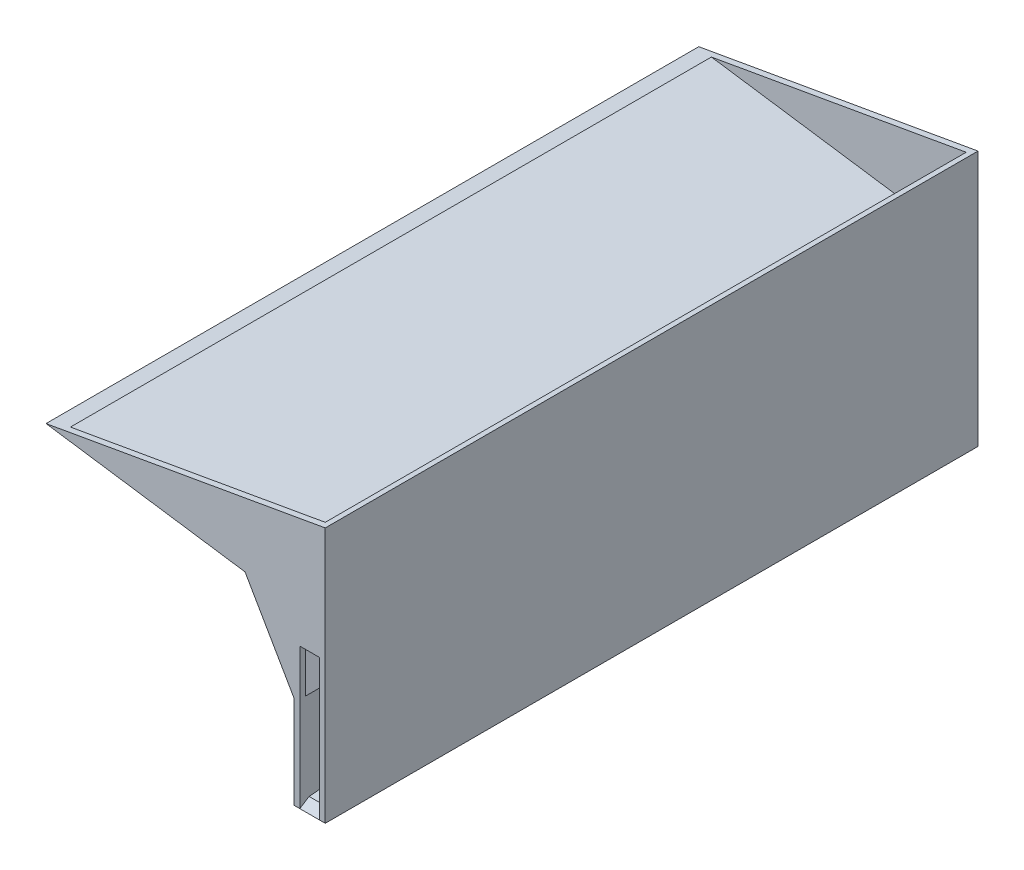
ISO-10303-21;
HEADER;
FILE_DESCRIPTION(('STEP AP214'),'2;1');
FILE_NAME('part.step','',(''),(''),'','','');
FILE_SCHEMA(('AUTOMOTIVE_DESIGN { 1 0 10303 214 1 1 1 1 }'));
ENDSEC;
DATA;
#1=APPLICATION_CONTEXT('core data for automotive mechanical design processes');
#2=APPLICATION_PROTOCOL_DEFINITION('international standard','automotive_design',2000,#1);
#3=PRODUCT_CONTEXT('',#1,'mechanical');
#4=PRODUCT('Part','Part','',(#3));
#5=PRODUCT_RELATED_PRODUCT_CATEGORY('part','',(#4));
#6=PRODUCT_DEFINITION_FORMATION('','',#4);
#7=PRODUCT_DEFINITION_CONTEXT('part definition',#1,'design');
#8=PRODUCT_DEFINITION('design','',#6,#7);
#9=PRODUCT_DEFINITION_SHAPE('','',#8);
#10=(LENGTH_UNIT() NAMED_UNIT(*) SI_UNIT(.MILLI.,.METRE.));
#11=(NAMED_UNIT(*) PLANE_ANGLE_UNIT() SI_UNIT($,.RADIAN.));
#12=(NAMED_UNIT(*) SI_UNIT($,.STERADIAN.) SOLID_ANGLE_UNIT());
#13=UNCERTAINTY_MEASURE_WITH_UNIT(LENGTH_MEASURE(1.E-05),#10,'distance_accuracy_value','');
#14=(GEOMETRIC_REPRESENTATION_CONTEXT(3) GLOBAL_UNCERTAINTY_ASSIGNED_CONTEXT((#13)) GLOBAL_UNIT_ASSIGNED_CONTEXT((#10,
#11,#12)) REPRESENTATION_CONTEXT('',''));
#15=CARTESIAN_POINT('',(0.,0.,0.));
#16=DIRECTION('',(0.,0.,1.));
#17=DIRECTION('',(1.,0.,0.));
#18=AXIS2_PLACEMENT_3D('',#15,#16,#17);
#19=CARTESIAN_POINT('',(12.7,-200.,701.675));
#20=DIRECTION('',(1.,0.,0.));
#21=DIRECTION('',(0.,0.,-1.));
#22=AXIS2_PLACEMENT_3D('',#19,#20,#21);
#23=PLANE('',#22);
#24=DIRECTION('',(0.,-1.,0.));
#25=VECTOR('',#24,1.);
#26=CARTESIAN_POINT('',(12.7,-187.3,701.675));
#27=LINE('',#26,#25);
#28=CARTESIAN_POINT('',(12.7,102.7,701.675));
#29=VERTEX_POINT('',#28);
#30=CARTESIAN_POINT('',(12.7,-200.,701.675));
#31=VERTEX_POINT('',#30);
#32=EDGE_CURVE('E69',#29,#31,#27,.T.);
#33=ORIENTED_EDGE('',*,*,#32,.T.);
#34=DIRECTION('',(0.,-0.536055885401426,0.844182496695172));
#35=VECTOR('',#34,1.);
#36=CARTESIAN_POINT('',(12.7,-187.3,681.675));
#37=LINE('',#36,#35);
#38=CARTESIAN_POINT('',(12.7,-187.3,681.675));
#39=VERTEX_POINT('',#38);
#40=EDGE_CURVE('E11',#31,#39,#37,.F.);
#41=ORIENTED_EDGE('',*,*,#40,.T.);
#42=DIRECTION('',(0.,-0.0871557427476516,0.996194698091746));
#43=VECTOR('',#42,1.);
#44=CARTESIAN_POINT('',(12.7,-67.3836633382015,-688.975));
#45=LINE('',#44,#43);
#46=CARTESIAN_POINT('',(12.7,-67.3836633382015,-688.975));
#47=VERTEX_POINT('',#46);
#48=EDGE_CURVE('E158',#47,#39,#45,.T.);
#49=ORIENTED_EDGE('',*,*,#48,.F.);
#50=DIRECTION('',(0.,-1.,0.));
#51=VECTOR('',#50,1.);
#52=CARTESIAN_POINT('',(12.7,-200.,-688.975));
#53=LINE('',#52,#51);
#54=CARTESIAN_POINT('',(12.7,3.40295474387526,-688.975));
#55=VERTEX_POINT('',#54);
#56=EDGE_CURVE('E170',#55,#47,#53,.T.);
#57=ORIENTED_EDGE('',*,*,#56,.F.);
#58=DIRECTION('',(0.,0.,-1.));
#59=VECTOR('',#58,1.);
#60=CARTESIAN_POINT('',(12.7,3.40295474387526,701.675));
#61=LINE('',#60,#59);
#62=CARTESIAN_POINT('',(12.7,3.40295474387526,688.975));
#63=VERTEX_POINT('',#62);
#64=EDGE_CURVE('E190',#63,#55,#61,.T.);
#65=ORIENTED_EDGE('',*,*,#64,.F.);
#66=DIRECTION('',(0.,-1.,0.));
#67=VECTOR('',#66,1.);
#68=CARTESIAN_POINT('',(12.7,0.,688.975));
#69=LINE('',#68,#67);
#70=CARTESIAN_POINT('',(12.7,102.7,688.975));
#71=VERTEX_POINT('',#70);
#72=EDGE_CURVE('E295',#71,#63,#69,.T.);
#73=ORIENTED_EDGE('',*,*,#72,.F.);
#74=DIRECTION('',(0.,0.,1.));
#75=VECTOR('',#74,1.);
#76=CARTESIAN_POINT('',(12.7,102.7,681.675));
#77=LINE('',#76,#75);
#78=EDGE_CURVE('E180',#71,#29,#77,.T.);
#79=ORIENTED_EDGE('',*,*,#78,.T.);
#80=EDGE_LOOP('',(#33,#41,#49,#57,#65,#73,#79));
#81=FACE_BOUND('',#80,.T.);
#82=ADVANCED_FACE('F45',(#81),#23,.T.);
#83=CARTESIAN_POINT('',(54.6999999999999,350.,701.675));
#84=DIRECTION('',(-1.,0.,0.));
#85=DIRECTION('',(0.,-1.,0.));
#86=AXIS2_PLACEMENT_3D('',#83,#84,#85);
#87=PLANE('',#86);
#88=DIRECTION('',(0.,1.,0.));
#89=VECTOR('',#88,1.);
#90=CARTESIAN_POINT('',(54.6999999999999,350.,-688.975));
#91=LINE('',#90,#89);
#92=CARTESIAN_POINT('',(54.7,-67.3836633382014,-688.975));
#93=VERTEX_POINT('',#92);
#94=CARTESIAN_POINT('',(54.6999999999999,347.760647345002,-688.975));
#95=VERTEX_POINT('',#94);
#96=EDGE_CURVE('E179',#93,#95,#91,.T.);
#97=ORIENTED_EDGE('',*,*,#96,.F.);
#98=DIRECTION('',(0.,0.0871557427476516,-0.996194698091746));
#99=VECTOR('',#98,1.);
#100=CARTESIAN_POINT('',(54.7,-67.3836633382015,-688.975));
#101=LINE('',#100,#99);
#102=CARTESIAN_POINT('',(54.7,-187.3,681.675));
#103=VERTEX_POINT('',#102);
#104=EDGE_CURVE('E161',#103,#93,#101,.T.);
#105=ORIENTED_EDGE('',*,*,#104,.F.);
#106=DIRECTION('',(0.,0.536055885401426,-0.844182496695172));
#107=VECTOR('',#106,1.);
#108=CARTESIAN_POINT('',(54.7,-187.3,681.675));
#109=LINE('',#108,#107);
#110=CARTESIAN_POINT('',(54.7,-200.,701.675));
#111=VERTEX_POINT('',#110);
#112=EDGE_CURVE('E55',#103,#111,#109,.F.);
#113=ORIENTED_EDGE('',*,*,#112,.T.);
#114=DIRECTION('',(0.,1.,0.));
#115=VECTOR('',#114,1.);
#116=CARTESIAN_POINT('',(54.7,-187.3,701.675));
#117=LINE('',#116,#115);
#118=CARTESIAN_POINT('',(54.7,102.7,701.675));
#119=VERTEX_POINT('',#118);
#120=EDGE_CURVE('E62',#111,#119,#117,.T.);
#121=ORIENTED_EDGE('',*,*,#120,.T.);
#122=DIRECTION('',(0.,0.,1.));
#123=VECTOR('',#122,1.);
#124=CARTESIAN_POINT('',(54.7,102.7,681.675));
#125=LINE('',#124,#123);
#126=CARTESIAN_POINT('',(54.7,102.7,688.975));
#127=VERTEX_POINT('',#126);
#128=EDGE_CURVE('E186',#127,#119,#125,.T.);
#129=ORIENTED_EDGE('',*,*,#128,.F.);
#130=DIRECTION('',(0.,1.,0.));
#131=VECTOR('',#130,1.);
#132=CARTESIAN_POINT('',(54.6999999999999,350.,688.975));
#133=LINE('',#132,#131);
#134=CARTESIAN_POINT('',(54.6999999999999,347.760647345002,688.975));
#135=VERTEX_POINT('',#134);
#136=EDGE_CURVE('E195',#127,#135,#133,.T.);
#137=ORIENTED_EDGE('',*,*,#136,.T.);
#138=DIRECTION('',(0.,0.,-1.));
#139=VECTOR('',#138,1.);
#140=CARTESIAN_POINT('',(54.7,347.760647345002,701.675));
#141=LINE('',#140,#139);
#142=EDGE_CURVE('E214',#135,#95,#141,.T.);
#143=ORIENTED_EDGE('',*,*,#142,.T.);
#144=EDGE_LOOP('',(#97,#105,#113,#121,#129,#137,#143));
#145=FACE_BOUND('',#144,.T.);
#146=ADVANCED_FACE('F300',(#145),#87,.T.);
#147=CARTESIAN_POINT('',(0.,0.,-688.975));
#148=DIRECTION('',(0.,0.,1.));
#149=DIRECTION('',(1.,0.,0.));
#150=AXIS2_PLACEMENT_3D('',#147,#148,#149);
#151=PLANE('',#150);
#152=ORIENTED_EDGE('',*,*,#56,.T.);
#153=DIRECTION('',(-1.,0.,0.));
#154=VECTOR('',#153,1.);
#155=CARTESIAN_POINT('',(1430.58566032879,-67.3836633382015,-688.975));
#156=LINE('',#155,#154);
#157=EDGE_CURVE('E154',#93,#47,#156,.T.);
#158=ORIENTED_EDGE('',*,*,#157,.F.);
#159=ORIENTED_EDGE('',*,*,#96,.T.);
#160=DIRECTION('',(-0.984807753012207,-0.173648177666935,0.));
#161=VECTOR('',#160,1.);
#162=CARTESIAN_POINT('',(-532.938806236242,244.144070894237,-688.975));
#163=LINE('',#162,#161);
#164=CARTESIAN_POINT('',(-493.064851650338,251.174924915276,-688.975));
#165=VERTEX_POINT('',#164);
#166=EDGE_CURVE('E184',#95,#165,#163,.T.);
#167=ORIENTED_EDGE('',*,*,#166,.T.);
#168=DIRECTION('',(0.989575536629476,-0.144014781548581,0.));
#169=VECTOR('',#168,1.);
#170=CARTESIAN_POINT('',(-103.171012274333,194.432944109926,-688.975));
#171=LINE('',#170,#169);
#172=CARTESIAN_POINT('',(-97.0793793235045,193.546417355561,-688.975));
#173=VERTEX_POINT('',#172);
#174=EDGE_CURVE('E205',#165,#173,#171,.T.);
#175=ORIENTED_EDGE('',*,*,#174,.T.);
#176=DIRECTION('',(0.500000000000001,-0.866025403784438,0.));
#177=VECTOR('',#176,1.);
#178=CARTESIAN_POINT('',(10.9985226280624,6.35000000000002,-688.975));
#179=LINE('',#178,#177);
#180=EDGE_CURVE('E177',#173,#55,#179,.T.);
#181=ORIENTED_EDGE('',*,*,#180,.T.);
#182=EDGE_LOOP('',(#152,#158,#159,#167,#175,#181));
#183=FACE_BOUND('',#182,.T.);
#184=ADVANCED_FACE('F175',(#183),#151,.T.);
#185=CARTESIAN_POINT('',(-532.938806236242,244.144070894237,701.675));
#186=DIRECTION('',(0.173648177666935,-0.984807753012207,0.));
#187=DIRECTION('',(0.984807753012207,0.173648177666935,0.));
#188=AXIS2_PLACEMENT_3D('',#185,#186,#187);
#189=PLANE('',#188);
#190=DIRECTION('',(-0.984807753012207,-0.173648177666935,0.));
#191=VECTOR('',#190,1.);
#192=CARTESIAN_POINT('',(-532.938806236242,244.144070894237,-701.675));
#193=LINE('',#192,#191);
#194=CARTESIAN_POINT('',(67.3999999999999,350.,-701.675));
#195=VERTEX_POINT('',#194);
#196=CARTESIAN_POINT('',(-532.938806236242,244.144070894237,-701.675));
#197=VERTEX_POINT('',#196);
#198=EDGE_CURVE('E260',#195,#197,#193,.T.);
#199=ORIENTED_EDGE('',*,*,#198,.T.);
#200=DIRECTION('',(0.,0.,-1.));
#201=VECTOR('',#200,1.);
#202=CARTESIAN_POINT('',(-532.938806236242,244.144070894237,701.675));
#203=LINE('',#202,#201);
#204=CARTESIAN_POINT('',(-532.938806236242,244.144070894237,701.675));
#205=VERTEX_POINT('',#204);
#206=EDGE_CURVE('E275',#205,#197,#203,.T.);
#207=ORIENTED_EDGE('',*,*,#206,.F.);
#208=DIRECTION('',(-0.984807753012207,-0.173648177666935,0.));
#209=VECTOR('',#208,1.);
#210=CARTESIAN_POINT('',(-532.938806236242,244.144070894237,701.675));
#211=LINE('',#210,#209);
#212=CARTESIAN_POINT('',(67.3999999999999,350.,701.675));
#213=VERTEX_POINT('',#212);
#214=EDGE_CURVE('E241',#213,#205,#211,.T.);
#215=ORIENTED_EDGE('',*,*,#214,.F.);
#216=DIRECTION('',(0.,0.,-1.));
#217=VECTOR('',#216,1.);
#218=CARTESIAN_POINT('',(67.3999999999999,350.,701.675));
#219=LINE('',#218,#217);
#220=EDGE_CURVE('E279',#213,#195,#219,.T.);
#221=ORIENTED_EDGE('',*,*,#220,.T.);
#222=EDGE_LOOP('',(#199,#207,#215,#221));
#223=FACE_BOUND('',#222,.T.);
#224=ORIENTED_EDGE('',*,*,#166,.F.);
#225=ORIENTED_EDGE('',*,*,#142,.F.);
#226=DIRECTION('',(-0.984807753012207,-0.173648177666935,0.));
#227=VECTOR('',#226,1.);
#228=CARTESIAN_POINT('',(-532.938806236242,244.144070894237,688.975));
#229=LINE('',#228,#227);
#230=CARTESIAN_POINT('',(-493.064851650338,251.174924915276,688.975));
#231=VERTEX_POINT('',#230);
#232=EDGE_CURVE('E198',#135,#231,#229,.T.);
#233=ORIENTED_EDGE('',*,*,#232,.T.);
#234=DIRECTION('',(0.,0.,-1.));
#235=VECTOR('',#234,1.);
#236=CARTESIAN_POINT('',(-493.064851650338,251.174924915276,701.675));
#237=LINE('',#236,#235);
#238=EDGE_CURVE('E211',#231,#165,#237,.T.);
#239=ORIENTED_EDGE('',*,*,#238,.T.);
#240=EDGE_LOOP('',(#224,#225,#233,#239));
#241=FACE_BOUND('',#240,.T.);
#242=ADVANCED_FACE('F335',(#223,#241),#189,.F.);
#243=CARTESIAN_POINT('',(0.,-200.,701.675));
#244=DIRECTION('',(1.,0.,0.));
#245=DIRECTION('',(0.,0.,-1.));
#246=AXIS2_PLACEMENT_3D('',#243,#244,#245);
#247=PLANE('',#246);
#248=DIRECTION('',(0.,-1.,0.));
#249=VECTOR('',#248,1.);
#250=CARTESIAN_POINT('',(0.,-200.,-701.675));
#251=LINE('',#250,#249);
#252=CARTESIAN_POINT('',(0.,0.,-701.675));
#253=VERTEX_POINT('',#252);
#254=CARTESIAN_POINT('',(0.,-200.,-701.675));
#255=VERTEX_POINT('',#254);
#256=EDGE_CURVE('E218',#253,#255,#251,.T.);
#257=ORIENTED_EDGE('',*,*,#256,.T.);
#258=DIRECTION('',(0.,0.,-1.));
#259=VECTOR('',#258,1.);
#260=CARTESIAN_POINT('',(0.,-200.,701.675));
#261=LINE('',#260,#259);
#262=CARTESIAN_POINT('',(0.,-200.,701.675));
#263=VERTEX_POINT('',#262);
#264=EDGE_CURVE('E287',#263,#255,#261,.T.);
#265=ORIENTED_EDGE('',*,*,#264,.F.);
#266=DIRECTION('',(0.,-1.,0.));
#267=VECTOR('',#266,1.);
#268=CARTESIAN_POINT('',(0.,-200.,701.675));
#269=LINE('',#268,#267);
#270=CARTESIAN_POINT('',(0.,0.,701.675));
#271=VERTEX_POINT('',#270);
#272=EDGE_CURVE('E227',#271,#263,#269,.T.);
#273=ORIENTED_EDGE('',*,*,#272,.F.);
#274=DIRECTION('',(0.,0.,-1.));
#275=VECTOR('',#274,1.);
#276=CARTESIAN_POINT('',(0.,0.,701.675));
#277=LINE('',#276,#275);
#278=EDGE_CURVE('E250',#271,#253,#277,.T.);
#279=ORIENTED_EDGE('',*,*,#278,.T.);
#280=EDGE_LOOP('',(#257,#265,#273,#279));
#281=FACE_BOUND('',#280,.T.);
#282=ADVANCED_FACE('F398',(#281),#247,.F.);
#283=CARTESIAN_POINT('',(67.4,-200.,701.675));
#284=DIRECTION('',(0.,1.,0.));
#285=DIRECTION('',(0.,0.,1.));
#286=AXIS2_PLACEMENT_3D('',#283,#284,#285);
#287=PLANE('',#286);
#288=DIRECTION('',(1.,0.,0.));
#289=VECTOR('',#288,1.);
#290=CARTESIAN_POINT('',(67.4,-200.,-701.675));
#291=LINE('',#290,#289);
#292=CARTESIAN_POINT('',(67.4,-200.,-701.675));
#293=VERTEX_POINT('',#292);
#294=EDGE_CURVE('E254',#255,#293,#291,.T.);
#295=ORIENTED_EDGE('',*,*,#294,.T.);
#296=DIRECTION('',(0.,0.,-1.));
#297=VECTOR('',#296,1.);
#298=CARTESIAN_POINT('',(67.4,-200.,701.675));
#299=LINE('',#298,#297);
#300=CARTESIAN_POINT('',(67.4,-200.,701.675));
#301=VERTEX_POINT('',#300);
#302=EDGE_CURVE('E283',#301,#293,#299,.T.);
#303=ORIENTED_EDGE('',*,*,#302,.F.);
#304=DIRECTION('',(1.,0.,0.));
#305=VECTOR('',#304,1.);
#306=CARTESIAN_POINT('',(67.4,-200.,701.675));
#307=LINE('',#306,#305);
#308=EDGE_CURVE('E231',#111,#301,#307,.T.);
#309=ORIENTED_EDGE('',*,*,#308,.F.);
#310=EDGE_CURVE('E238',#31,#111,#307,.T.);
#311=ORIENTED_EDGE('',*,*,#310,.F.);
#312=EDGE_CURVE('E233',#263,#31,#307,.T.);
#313=ORIENTED_EDGE('',*,*,#312,.F.);
#314=ORIENTED_EDGE('',*,*,#264,.T.);
#315=EDGE_LOOP('',(#295,#303,#309,#311,#313,#314));
#316=FACE_BOUND('',#315,.T.);
#317=ADVANCED_FACE('F306',(#316),#287,.F.);
#318=CARTESIAN_POINT('',(67.3999999999999,350.,701.675));
#319=DIRECTION('',(-1.,0.,0.));
#320=DIRECTION('',(0.,-1.,0.));
#321=AXIS2_PLACEMENT_3D('',#318,#319,#320);
#322=PLANE('',#321);
#323=DIRECTION('',(0.,1.,0.));
#324=VECTOR('',#323,1.);
#325=CARTESIAN_POINT('',(67.3999999999999,350.,-701.675));
#326=LINE('',#325,#324);
#327=EDGE_CURVE('E257',#293,#195,#326,.T.);
#328=ORIENTED_EDGE('',*,*,#327,.T.);
#329=ORIENTED_EDGE('',*,*,#220,.F.);
#330=DIRECTION('',(0.,1.,0.));
#331=VECTOR('',#330,1.);
#332=CARTESIAN_POINT('',(67.3999999999999,350.,701.675));
#333=LINE('',#332,#331);
#334=EDGE_CURVE('E237',#301,#213,#333,.T.);
#335=ORIENTED_EDGE('',*,*,#334,.F.);
#336=ORIENTED_EDGE('',*,*,#302,.T.);
#337=EDGE_LOOP('',(#328,#329,#335,#336));
#338=FACE_BOUND('',#337,.T.);
#339=ADVANCED_FACE('F397',(#338),#322,.F.);
#340=CARTESIAN_POINT('',(-105.,181.865334794732,701.675));
#341=DIRECTION('',(0.144014781548581,0.989575536629476,0.));
#342=DIRECTION('',(-0.989575536629476,0.144014781548581,0.));
#343=AXIS2_PLACEMENT_3D('',#340,#341,#342);
#344=PLANE('',#343);
#345=DIRECTION('',(0.989575536629476,-0.144014781548581,0.));
#346=VECTOR('',#345,1.);
#347=CARTESIAN_POINT('',(-105.,181.865334794732,-701.675));
#348=LINE('',#347,#346);
#349=CARTESIAN_POINT('',(-105.,181.865334794732,-701.675));
#350=VERTEX_POINT('',#349);
#351=EDGE_CURVE('E263',#197,#350,#348,.T.);
#352=ORIENTED_EDGE('',*,*,#351,.T.);
#353=DIRECTION('',(0.,0.,-1.));
#354=VECTOR('',#353,1.);
#355=CARTESIAN_POINT('',(-105.,181.865334794732,701.675));
#356=LINE('',#355,#354);
#357=CARTESIAN_POINT('',(-105.,181.865334794732,701.675));
#358=VERTEX_POINT('',#357);
#359=EDGE_CURVE('E271',#358,#350,#356,.T.);
#360=ORIENTED_EDGE('',*,*,#359,.F.);
#361=DIRECTION('',(0.989575536629476,-0.144014781548581,0.));
#362=VECTOR('',#361,1.);
#363=CARTESIAN_POINT('',(-105.,181.865334794732,701.675));
#364=LINE('',#363,#362);
#365=EDGE_CURVE('E244',#205,#358,#364,.T.);
#366=ORIENTED_EDGE('',*,*,#365,.F.);
#367=ORIENTED_EDGE('',*,*,#206,.T.);
#368=EDGE_LOOP('',(#352,#360,#366,#367));
#369=FACE_BOUND('',#368,.T.);
#370=ADVANCED_FACE('F470',(#369),#344,.F.);
#371=CARTESIAN_POINT('',(0.,0.,701.675));
#372=DIRECTION('',(0.866025403784438,0.500000000000001,0.));
#373=DIRECTION('',(-0.500000000000001,0.866025403784438,0.));
#374=AXIS2_PLACEMENT_3D('',#371,#372,#373);
#375=PLANE('',#374);
#376=DIRECTION('',(0.500000000000001,-0.866025403784438,0.));
#377=VECTOR('',#376,1.);
#378=CARTESIAN_POINT('',(0.,0.,-701.675));
#379=LINE('',#378,#377);
#380=EDGE_CURVE('E232',#350,#253,#379,.T.);
#381=ORIENTED_EDGE('',*,*,#380,.T.);
#382=ORIENTED_EDGE('',*,*,#278,.F.);
#383=DIRECTION('',(0.500000000000001,-0.866025403784438,0.));
#384=VECTOR('',#383,1.);
#385=CARTESIAN_POINT('',(0.,0.,701.675));
#386=LINE('',#385,#384);
#387=EDGE_CURVE('E247',#358,#271,#386,.T.);
#388=ORIENTED_EDGE('',*,*,#387,.F.);
#389=ORIENTED_EDGE('',*,*,#359,.T.);
#390=EDGE_LOOP('',(#381,#382,#388,#389));
#391=FACE_BOUND('',#390,.T.);
#392=ADVANCED_FACE('F383',(#391),#375,.F.);
#393=CARTESIAN_POINT('',(0.,0.,701.675));
#394=DIRECTION('',(0.,0.,1.));
#395=DIRECTION('',(1.,0.,0.));
#396=AXIS2_PLACEMENT_3D('',#393,#394,#395);
#397=PLANE('',#396);
#398=ORIENTED_EDGE('',*,*,#120,.F.);
#399=ORIENTED_EDGE('',*,*,#308,.T.);
#400=ORIENTED_EDGE('',*,*,#334,.T.);
#401=ORIENTED_EDGE('',*,*,#214,.T.);
#402=ORIENTED_EDGE('',*,*,#365,.T.);
#403=ORIENTED_EDGE('',*,*,#387,.T.);
#404=ORIENTED_EDGE('',*,*,#272,.T.);
#405=ORIENTED_EDGE('',*,*,#312,.T.);
#406=ORIENTED_EDGE('',*,*,#32,.F.);
#407=DIRECTION('',(-1.,0.,0.));
#408=VECTOR('',#407,1.);
#409=CARTESIAN_POINT('',(12.7,102.7,701.675));
#410=LINE('',#409,#408);
#411=EDGE_CURVE('E319',#119,#29,#410,.T.);
#412=ORIENTED_EDGE('',*,*,#411,.F.);
#413=EDGE_LOOP('',(#398,#399,#400,#401,#402,#403,#404,#405,#406,#412));
#414=FACE_BOUND('',#413,.T.);
#415=ADVANCED_FACE('F378',(#414),#397,.T.);
#416=CARTESIAN_POINT('',(0.,0.,-701.675));
#417=DIRECTION('',(0.,0.,1.));
#418=DIRECTION('',(1.,0.,0.));
#419=AXIS2_PLACEMENT_3D('',#416,#417,#418);
#420=PLANE('',#419);
#421=ORIENTED_EDGE('',*,*,#256,.F.);
#422=ORIENTED_EDGE('',*,*,#380,.F.);
#423=ORIENTED_EDGE('',*,*,#351,.F.);
#424=ORIENTED_EDGE('',*,*,#198,.F.);
#425=ORIENTED_EDGE('',*,*,#327,.F.);
#426=ORIENTED_EDGE('',*,*,#294,.F.);
#427=EDGE_LOOP('',(#421,#422,#423,#424,#425,#426));
#428=FACE_BOUND('',#427,.T.);
#429=ADVANCED_FACE('F349',(#428),#420,.F.);
#430=CARTESIAN_POINT('',(-103.171012274333,194.432944109926,701.675));
#431=DIRECTION('',(0.144014781548581,0.989575536629476,0.));
#432=DIRECTION('',(-0.989575536629476,0.144014781548581,0.));
#433=AXIS2_PLACEMENT_3D('',#430,#431,#432);
#434=PLANE('',#433);
#435=ORIENTED_EDGE('',*,*,#174,.F.);
#436=ORIENTED_EDGE('',*,*,#238,.F.);
#437=DIRECTION('',(0.989575536629476,-0.144014781548581,0.));
#438=VECTOR('',#437,1.);
#439=CARTESIAN_POINT('',(-103.171012274333,194.432944109926,688.975));
#440=LINE('',#439,#438);
#441=CARTESIAN_POINT('',(-97.0793793235045,193.546417355561,688.975));
#442=VERTEX_POINT('',#441);
#443=EDGE_CURVE('E199',#231,#442,#440,.T.);
#444=ORIENTED_EDGE('',*,*,#443,.T.);
#445=DIRECTION('',(0.,0.,-1.));
#446=VECTOR('',#445,1.);
#447=CARTESIAN_POINT('',(-97.0793793235045,193.546417355561,701.675));
#448=LINE('',#447,#446);
#449=EDGE_CURVE('E192',#442,#173,#448,.T.);
#450=ORIENTED_EDGE('',*,*,#449,.T.);
#451=EDGE_LOOP('',(#435,#436,#444,#450));
#452=FACE_BOUND('',#451,.T.);
#453=ADVANCED_FACE('F338',(#452),#434,.T.);
#454=CARTESIAN_POINT('',(10.9985226280624,6.35000000000002,701.675));
#455=DIRECTION('',(0.866025403784438,0.500000000000001,0.));
#456=DIRECTION('',(-0.500000000000001,0.866025403784438,0.));
#457=AXIS2_PLACEMENT_3D('',#454,#455,#456);
#458=PLANE('',#457);
#459=ORIENTED_EDGE('',*,*,#180,.F.);
#460=ORIENTED_EDGE('',*,*,#449,.F.);
#461=DIRECTION('',(0.500000000000001,-0.866025403784438,0.));
#462=VECTOR('',#461,1.);
#463=CARTESIAN_POINT('',(10.9985226280624,6.35000000000002,688.975));
#464=LINE('',#463,#462);
#465=EDGE_CURVE('E193',#442,#63,#464,.T.);
#466=ORIENTED_EDGE('',*,*,#465,.T.);
#467=ORIENTED_EDGE('',*,*,#64,.T.);
#468=EDGE_LOOP('',(#459,#460,#466,#467));
#469=FACE_BOUND('',#468,.T.);
#470=ADVANCED_FACE('F341',(#469),#458,.T.);
#471=CARTESIAN_POINT('',(0.,0.,688.975));
#472=DIRECTION('',(0.,0.,1.));
#473=DIRECTION('',(1.,0.,0.));
#474=AXIS2_PLACEMENT_3D('',#471,#472,#473);
#475=PLANE('',#474);
#476=DIRECTION('',(-1.,0.,0.));
#477=VECTOR('',#476,1.);
#478=CARTESIAN_POINT('',(0.,102.7,688.975));
#479=LINE('',#478,#477);
#480=EDGE_CURVE('E291',#127,#71,#479,.T.);
#481=ORIENTED_EDGE('',*,*,#480,.T.);
#482=ORIENTED_EDGE('',*,*,#72,.T.);
#483=ORIENTED_EDGE('',*,*,#465,.F.);
#484=ORIENTED_EDGE('',*,*,#443,.F.);
#485=ORIENTED_EDGE('',*,*,#232,.F.);
#486=ORIENTED_EDGE('',*,*,#136,.F.);
#487=EDGE_LOOP('',(#481,#482,#483,#484,#485,#486));
#488=FACE_BOUND('',#487,.T.);
#489=ADVANCED_FACE('F329',(#488),#475,.F.);
#490=CARTESIAN_POINT('',(12.7,102.7,681.675));
#491=DIRECTION('',(0.,1.,0.));
#492=DIRECTION('',(0.,0.,1.));
#493=AXIS2_PLACEMENT_3D('',#490,#491,#492);
#494=PLANE('',#493);
#495=ORIENTED_EDGE('',*,*,#128,.T.);
#496=ORIENTED_EDGE('',*,*,#411,.T.);
#497=ORIENTED_EDGE('',*,*,#78,.F.);
#498=ORIENTED_EDGE('',*,*,#480,.F.);
#499=EDGE_LOOP('',(#495,#496,#497,#498));
#500=FACE_BOUND('',#499,.T.);
#501=ADVANCED_FACE('F325',(#500),#494,.F.);
#502=CARTESIAN_POINT('',(1430.58566032879,-67.3836633382015,-688.975));
#503=DIRECTION('',(0.,-0.996194698091746,-0.0871557427476516));
#504=DIRECTION('',(0.,0.0871557427476516,-0.996194698091746));
#505=AXIS2_PLACEMENT_3D('',#502,#503,#504);
#506=PLANE('',#505);
#507=DIRECTION('',(-1.,0.,0.));
#508=VECTOR('',#507,1.);
#509=CARTESIAN_POINT('',(1430.58566032879,-187.3,681.675));
#510=LINE('',#509,#508);
#511=EDGE_CURVE('E166',#103,#39,#510,.T.);
#512=ORIENTED_EDGE('',*,*,#511,.F.);
#513=ORIENTED_EDGE('',*,*,#104,.T.);
#514=ORIENTED_EDGE('',*,*,#157,.T.);
#515=ORIENTED_EDGE('',*,*,#48,.T.);
#516=EDGE_LOOP('',(#512,#513,#514,#515));
#517=FACE_BOUND('',#516,.T.);
#518=ADVANCED_FACE('F157',(#517),#506,.F.);
#519=CARTESIAN_POINT('',(67.4,-187.3,681.675));
#520=DIRECTION('',(0.,-0.844182496695172,-0.536055885401426));
#521=DIRECTION('',(1.,0.,0.));
#522=AXIS2_PLACEMENT_3D('',#519,#520,#521);
#523=PLANE('',#522);
#524=ORIENTED_EDGE('',*,*,#40,.F.);
#525=ORIENTED_EDGE('',*,*,#310,.T.);
#526=ORIENTED_EDGE('',*,*,#112,.F.);
#527=ORIENTED_EDGE('',*,*,#511,.T.);
#528=EDGE_LOOP('',(#524,#525,#526,#527));
#529=FACE_BOUND('',#528,.T.);
#530=ADVANCED_FACE('F48',(#529),#523,.F.);
#531=CLOSED_SHELL('',(#82,#146,#184,#242,#282,#317,#339,#370,#392,#415,#429,#453,#470,#489,#501,
#518,#530));
#532=MANIFOLD_SOLID_BREP('B2',#531);
#533=ADVANCED_BREP_SHAPE_REPRESENTATION('',(#18,#532),#14);
#534=SHAPE_DEFINITION_REPRESENTATION(#9,#533);
ENDSEC;
END-ISO-10303-21;
